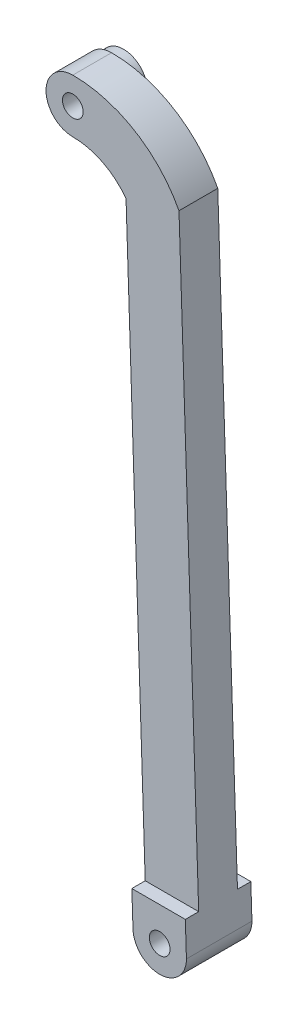
ISO-10303-21;
HEADER;
FILE_DESCRIPTION(('STEP AP214'),'2;1');
FILE_NAME('part.step','',(''),(''),'','','');
FILE_SCHEMA(('AUTOMOTIVE_DESIGN { 1 0 10303 214 1 1 1 1 }'));
ENDSEC;
DATA;
#1=APPLICATION_CONTEXT('core data for automotive mechanical design processes');
#2=APPLICATION_PROTOCOL_DEFINITION('international standard','automotive_design',2000,#1);
#3=PRODUCT_CONTEXT('',#1,'mechanical');
#4=PRODUCT('Part','Part','',(#3));
#5=PRODUCT_RELATED_PRODUCT_CATEGORY('part','',(#4));
#6=PRODUCT_DEFINITION_FORMATION('','',#4);
#7=PRODUCT_DEFINITION_CONTEXT('part definition',#1,'design');
#8=PRODUCT_DEFINITION('design','',#6,#7);
#9=PRODUCT_DEFINITION_SHAPE('','',#8);
#10=(LENGTH_UNIT() NAMED_UNIT(*) SI_UNIT(.MILLI.,.METRE.));
#11=(NAMED_UNIT(*) PLANE_ANGLE_UNIT() SI_UNIT($,.RADIAN.));
#12=(NAMED_UNIT(*) SI_UNIT($,.STERADIAN.) SOLID_ANGLE_UNIT());
#13=UNCERTAINTY_MEASURE_WITH_UNIT(LENGTH_MEASURE(1.E-05),#10,'distance_accuracy_value','');
#14=(GEOMETRIC_REPRESENTATION_CONTEXT(3) GLOBAL_UNCERTAINTY_ASSIGNED_CONTEXT((#13)) GLOBAL_UNIT_ASSIGNED_CONTEXT((#10,
#11,#12)) REPRESENTATION_CONTEXT('',''));
#15=CARTESIAN_POINT('',(0.,0.,0.));
#16=DIRECTION('',(0.,0.,1.));
#17=DIRECTION('',(1.,0.,0.));
#18=AXIS2_PLACEMENT_3D('',#15,#16,#17);
#19=CARTESIAN_POINT('',(-14.9999999999995,86.0802107758638,-2.9));
#20=DIRECTION('',(0.,0.,-1.));
#21=DIRECTION('',(1.,0.,0.));
#22=AXIS2_PLACEMENT_3D('',#19,#20,#21);
#23=PLANE('',#22);
#24=CARTESIAN_POINT('',(-14.9999999999995,86.0802107758638,-2.9));
#25=DIRECTION('',(0.,0.,1.));
#26=DIRECTION('',(1.,0.,0.));
#27=AXIS2_PLACEMENT_3D('',#24,#25,#26);
#28=CIRCLE('',#27,17.9197892241362);
#29=CARTESIAN_POINT('',(0.886406152850304,94.3712267198939,-2.9));
#30=VERTEX_POINT('',#29);
#31=CARTESIAN_POINT('',(-15.,104.,-2.9));
#32=VERTEX_POINT('',#31);
#33=EDGE_CURVE('E113',#30,#32,#28,.T.);
#34=ORIENTED_EDGE('',*,*,#33,.F.);
#35=DIRECTION('',(-0.0329750995146301,0.999456173532387,0.));
#36=VECTOR('',#35,1.);
#37=CARTESIAN_POINT('',(0.886406152850304,94.3712267198939,-2.9));
#38=LINE('',#37,#36);
#39=CARTESIAN_POINT('',(3.83368811201994,5.04081702921773,-2.9));
#40=VERTEX_POINT('',#39);
#41=EDGE_CURVE('E117',#40,#30,#38,.T.);
#42=ORIENTED_EDGE('',*,*,#41,.F.);
#43=DIRECTION('',(1.,0.,0.));
#44=VECTOR('',#43,1.);
#45=CARTESIAN_POINT('',(-4.16631188798006,5.04081702921773,-2.9));
#46=LINE('',#45,#44);
#47=CARTESIAN_POINT('',(-4.16631188798006,5.04081702921773,-2.9));
#48=VERTEX_POINT('',#47);
#49=EDGE_CURVE('E131',#48,#40,#46,.T.);
#50=ORIENTED_EDGE('',*,*,#49,.F.);
#51=DIRECTION('',(0.0329750995146301,-0.999456173532387,0.));
#52=VECTOR('',#51,1.);
#53=CARTESIAN_POINT('',(-7.03513466607657,91.993174369846,-2.9));
#54=LINE('',#53,#52);
#55=CARTESIAN_POINT('',(-7.03513466607657,91.993174369846,-2.9));
#56=VERTEX_POINT('',#55);
#57=EDGE_CURVE('E208',#56,#48,#54,.T.);
#58=ORIENTED_EDGE('',*,*,#57,.F.);
#59=CARTESIAN_POINT('',(-15.,86.0802107758631,-2.9));
#60=DIRECTION('',(0.,0.,-1.));
#61=DIRECTION('',(1.,0.,0.));
#62=AXIS2_PLACEMENT_3D('',#59,#60,#61);
#63=CIRCLE('',#62,9.91978922413689);
#64=CARTESIAN_POINT('',(-15.,96.,-2.9));
#65=VERTEX_POINT('',#64);
#66=EDGE_CURVE('E206',#65,#56,#63,.T.);
#67=ORIENTED_EDGE('',*,*,#66,.F.);
#68=CARTESIAN_POINT('',(-15.,100.,-2.9));
#69=DIRECTION('',(0.,0.,1.));
#70=DIRECTION('',(1.,0.,0.));
#71=AXIS2_PLACEMENT_3D('',#68,#69,#70);
#72=CIRCLE('',#71,4.);
#73=EDGE_CURVE('E119',#32,#65,#72,.T.);
#74=ORIENTED_EDGE('',*,*,#73,.F.);
#75=EDGE_LOOP('',(#34,#42,#50,#58,#67,#74));
#76=FACE_BOUND('',#75,.T.);
#77=CARTESIAN_POINT('',(-15.,100.,-2.9));
#78=DIRECTION('',(0.,0.,-1.));
#79=DIRECTION('',(-1.,0.,0.));
#80=AXIS2_PLACEMENT_3D('',#77,#78,#79);
#81=CIRCLE('',#80,3.55);
#82=CARTESIAN_POINT('',(-18.55,100.,-2.9));
#83=VERTEX_POINT('',#82);
#84=EDGE_CURVE('E212',#83,#83,#81,.T.);
#85=ORIENTED_EDGE('',*,*,#84,.F.);
#86=EDGE_LOOP('',(#85));
#87=FACE_BOUND('',#86,.T.);
#88=ADVANCED_FACE('F35',(#76,#87),#23,.T.);
#89=CARTESIAN_POINT('',(-15.,86.0802107758631,-4.9));
#90=DIRECTION('',(0.,0.,1.));
#91=DIRECTION('',(1.,0.,0.));
#92=AXIS2_PLACEMENT_3D('',#89,#90,#91);
#93=CYLINDRICAL_SURFACE('',#92,9.91978922413684);
#94=ORIENTED_EDGE('',*,*,#66,.T.);
#95=DIRECTION('',(0.,0.,1.));
#96=VECTOR('',#95,1.);
#97=CARTESIAN_POINT('',(-7.03513466607657,91.993174369846,-4.9));
#98=LINE('',#97,#96);
#99=CARTESIAN_POINT('',(-7.03513466607657,91.993174369846,2.9));
#100=VERTEX_POINT('',#99);
#101=EDGE_CURVE('E39',#56,#100,#98,.T.);
#102=ORIENTED_EDGE('',*,*,#101,.T.);
#103=CARTESIAN_POINT('',(-15.,86.0802107758631,2.9));
#104=DIRECTION('',(0.,0.,-1.));
#105=DIRECTION('',(1.,0.,0.));
#106=AXIS2_PLACEMENT_3D('',#103,#104,#105);
#107=CIRCLE('',#106,9.91978922413689);
#108=CARTESIAN_POINT('',(-15.,96.,2.9));
#109=VERTEX_POINT('',#108);
#110=EDGE_CURVE('E194',#109,#100,#107,.T.);
#111=ORIENTED_EDGE('',*,*,#110,.F.);
#112=DIRECTION('',(0.,0.,1.));
#113=VECTOR('',#112,1.);
#114=CARTESIAN_POINT('',(-15.,96.,-4.9));
#115=LINE('',#114,#113);
#116=EDGE_CURVE('E11',#65,#109,#115,.T.);
#117=ORIENTED_EDGE('',*,*,#116,.F.);
#118=EDGE_LOOP('',(#94,#102,#111,#117));
#119=FACE_BOUND('',#118,.T.);
#120=ADVANCED_FACE('F37',(#119),#93,.F.);
#121=CARTESIAN_POINT('',(-15.,100.,-4.9));
#122=DIRECTION('',(0.,0.,1.));
#123=DIRECTION('',(1.,0.,0.));
#124=AXIS2_PLACEMENT_3D('',#121,#122,#123);
#125=CYLINDRICAL_SURFACE('',#124,4.);
#126=DIRECTION('',(0.,0.,1.));
#127=VECTOR('',#126,1.);
#128=CARTESIAN_POINT('',(-15.,104.,-4.9));
#129=LINE('',#128,#127);
#130=CARTESIAN_POINT('',(-15.,104.,2.9));
#131=VERTEX_POINT('',#130);
#132=EDGE_CURVE('E44',#32,#131,#129,.T.);
#133=ORIENTED_EDGE('',*,*,#132,.F.);
#134=ORIENTED_EDGE('',*,*,#73,.T.);
#135=ORIENTED_EDGE('',*,*,#116,.T.);
#136=CARTESIAN_POINT('',(-15.,100.,2.9));
#137=DIRECTION('',(0.,0.,1.));
#138=DIRECTION('',(1.,0.,0.));
#139=AXIS2_PLACEMENT_3D('',#136,#137,#138);
#140=CIRCLE('',#139,4.);
#141=EDGE_CURVE('E196',#131,#109,#140,.T.);
#142=ORIENTED_EDGE('',*,*,#141,.F.);
#143=EDGE_LOOP('',(#133,#134,#135,#142));
#144=FACE_BOUND('',#143,.T.);
#145=ADVANCED_FACE('F244',(#144),#125,.T.);
#146=CARTESIAN_POINT('',(-15.,86.0802107758631,-4.9));
#147=DIRECTION('',(0.,0.,1.));
#148=DIRECTION('',(1.,0.,0.));
#149=AXIS2_PLACEMENT_3D('',#146,#147,#148);
#150=CYLINDRICAL_SURFACE('',#149,17.9197892241369);
#151=ORIENTED_EDGE('',*,*,#33,.T.);
#152=ORIENTED_EDGE('',*,*,#132,.T.);
#153=CARTESIAN_POINT('',(-14.9999999999995,86.0802107758638,2.9));
#154=DIRECTION('',(0.,0.,1.));
#155=DIRECTION('',(1.,0.,0.));
#156=AXIS2_PLACEMENT_3D('',#153,#154,#155);
#157=CIRCLE('',#156,17.9197892241362);
#158=CARTESIAN_POINT('',(0.886406152850304,94.3712267198939,2.9));
#159=VERTEX_POINT('',#158);
#160=EDGE_CURVE('E136',#159,#131,#157,.T.);
#161=ORIENTED_EDGE('',*,*,#160,.F.);
#162=DIRECTION('',(0.,0.,1.));
#163=VECTOR('',#162,1.);
#164=CARTESIAN_POINT('',(0.886406152850304,94.3712267198939,-4.9));
#165=LINE('',#164,#163);
#166=EDGE_CURVE('E129',#30,#159,#165,.T.);
#167=ORIENTED_EDGE('',*,*,#166,.F.);
#168=EDGE_LOOP('',(#151,#152,#161,#167));
#169=FACE_BOUND('',#168,.T.);
#170=ADVANCED_FACE('F134',(#169),#150,.T.);
#171=CARTESIAN_POINT('',(-15.,100.,-4.9));
#172=DIRECTION('',(0.,0.,1.));
#173=DIRECTION('',(1.,0.,0.));
#174=AXIS2_PLACEMENT_3D('',#171,#172,#173);
#175=CYLINDRICAL_SURFACE('',#174,1.55);
#176=CARTESIAN_POINT('',(-15.,100.,2.9));
#177=DIRECTION('',(0.,0.,1.));
#178=DIRECTION('',(1.,0.,0.));
#179=AXIS2_PLACEMENT_3D('',#176,#177,#178);
#180=CIRCLE('',#179,1.55);
#181=CARTESIAN_POINT('',(-13.45,100.,2.9));
#182=VERTEX_POINT('',#181);
#183=EDGE_CURVE('E176',#182,#182,#180,.F.);
#184=ORIENTED_EDGE('',*,*,#183,.F.);
#185=EDGE_LOOP('',(#184));
#186=FACE_BOUND('',#185,.T.);
#187=CARTESIAN_POINT('',(-15.,100.,-4.7));
#188=DIRECTION('',(0.,0.,-1.));
#189=DIRECTION('',(-1.,0.,0.));
#190=AXIS2_PLACEMENT_3D('',#187,#188,#189);
#191=CIRCLE('',#190,1.55);
#192=CARTESIAN_POINT('',(-16.55,100.,-4.7));
#193=VERTEX_POINT('',#192);
#194=EDGE_CURVE('E215',#193,#193,#191,.T.);
#195=ORIENTED_EDGE('',*,*,#194,.T.);
#196=EDGE_LOOP('',(#195));
#197=FACE_BOUND('',#196,.T.);
#198=ADVANCED_FACE('F221',(#186,#197),#175,.F.);
#199=CARTESIAN_POINT('',(3.995650571248,0.131828667130967,-4.9));
#200=DIRECTION('',(0.999456173532387,0.0329750995146301,0.));
#201=DIRECTION('',(-0.0329750995146301,0.999456173532387,0.));
#202=AXIS2_PLACEMENT_3D('',#199,#200,#201);
#203=PLANE('',#202);
#204=DIRECTION('',(-0.0329750995146301,0.999456173532387,0.));
#205=VECTOR('',#204,1.);
#206=CARTESIAN_POINT('',(3.995650571248,0.131828667130967,-4.9));
#207=LINE('',#206,#205);
#208=CARTESIAN_POINT('',(4.,0.,-4.9));
#209=VERTEX_POINT('',#208);
#210=CARTESIAN_POINT('',(3.83368811201994,5.04081702921773,-4.9));
#211=VERTEX_POINT('',#210);
#212=EDGE_CURVE('E153',#209,#211,#207,.T.);
#213=ORIENTED_EDGE('',*,*,#212,.T.);
#214=DIRECTION('',(0.,0.,-1.));
#215=VECTOR('',#214,1.);
#216=CARTESIAN_POINT('',(3.83368811201994,5.04081702921773,-2.9));
#217=LINE('',#216,#215);
#218=EDGE_CURVE('E52',#40,#211,#217,.T.);
#219=ORIENTED_EDGE('',*,*,#218,.F.);
#220=ORIENTED_EDGE('',*,*,#41,.T.);
#221=ORIENTED_EDGE('',*,*,#166,.T.);
#222=DIRECTION('',(-0.0329750995146301,0.999456173532387,0.));
#223=VECTOR('',#222,1.);
#224=CARTESIAN_POINT('',(0.886406152850304,94.3712267198939,2.9));
#225=LINE('',#224,#223);
#226=CARTESIAN_POINT('',(3.83368811201994,5.04081702921773,2.9));
#227=VERTEX_POINT('',#226);
#228=EDGE_CURVE('E181',#227,#159,#225,.T.);
#229=ORIENTED_EDGE('',*,*,#228,.F.);
#230=DIRECTION('',(0.,0.,1.));
#231=VECTOR('',#230,1.);
#232=CARTESIAN_POINT('',(3.83368811201994,5.04081702921773,2.9));
#233=LINE('',#232,#231);
#234=CARTESIAN_POINT('',(3.83368811201994,5.04081702921773,4.9));
#235=VERTEX_POINT('',#234);
#236=EDGE_CURVE('E179',#227,#235,#233,.T.);
#237=ORIENTED_EDGE('',*,*,#236,.T.);
#238=DIRECTION('',(-0.0329750995146301,0.999456173532387,0.));
#239=VECTOR('',#238,1.);
#240=CARTESIAN_POINT('',(3.995650571248,0.131828667130967,4.9));
#241=LINE('',#240,#239);
#242=CARTESIAN_POINT('',(4.,0.,4.9));
#243=VERTEX_POINT('',#242);
#244=EDGE_CURVE('E168',#243,#235,#241,.T.);
#245=ORIENTED_EDGE('',*,*,#244,.F.);
#246=DIRECTION('',(0.,0.,1.));
#247=VECTOR('',#246,1.);
#248=CARTESIAN_POINT('',(4.,0.,-4.9));
#249=LINE('',#248,#247);
#250=EDGE_CURVE('E137',#209,#243,#249,.T.);
#251=ORIENTED_EDGE('',*,*,#250,.F.);
#252=EDGE_LOOP('',(#213,#219,#220,#221,#229,#237,#245,#251));
#253=FACE_BOUND('',#252,.T.);
#254=ADVANCED_FACE('F127',(#253),#203,.T.);
#255=CARTESIAN_POINT('',(-3.995650571248,-0.131828667130967,-4.9));
#256=DIRECTION('',(0.999456173532387,0.0329750995146301,0.));
#257=DIRECTION('',(-0.0329750995146301,0.999456173532387,0.));
#258=AXIS2_PLACEMENT_3D('',#255,#256,#257);
#259=PLANE('',#258);
#260=DIRECTION('',(0.,0.,-1.));
#261=VECTOR('',#260,1.);
#262=CARTESIAN_POINT('',(-4.16631188798006,5.04081702921773,-2.9));
#263=LINE('',#262,#261);
#264=CARTESIAN_POINT('',(-4.16631188798006,5.04081702921773,-4.9));
#265=VERTEX_POINT('',#264);
#266=EDGE_CURVE('E186',#48,#265,#263,.T.);
#267=ORIENTED_EDGE('',*,*,#266,.T.);
#268=DIRECTION('',(-0.0329750995146301,0.999456173532387,0.));
#269=VECTOR('',#268,1.);
#270=CARTESIAN_POINT('',(-3.995650571248,-0.131828667130967,-4.9));
#271=LINE('',#270,#269);
#272=CARTESIAN_POINT('',(-4.,0.,-4.9));
#273=VERTEX_POINT('',#272);
#274=EDGE_CURVE('E162',#273,#265,#271,.T.);
#275=ORIENTED_EDGE('',*,*,#274,.F.);
#276=DIRECTION('',(0.,0.,1.));
#277=VECTOR('',#276,1.);
#278=CARTESIAN_POINT('',(-4.,0.,-4.9));
#279=LINE('',#278,#277);
#280=CARTESIAN_POINT('',(-4.,0.,4.9));
#281=VERTEX_POINT('',#280);
#282=EDGE_CURVE('E140',#273,#281,#279,.T.);
#283=ORIENTED_EDGE('',*,*,#282,.T.);
#284=DIRECTION('',(-0.0329750995146301,0.999456173532387,0.));
#285=VECTOR('',#284,1.);
#286=CARTESIAN_POINT('',(-3.995650571248,-0.131828667130967,4.9));
#287=LINE('',#286,#285);
#288=CARTESIAN_POINT('',(-4.16631188798006,5.04081702921773,4.9));
#289=VERTEX_POINT('',#288);
#290=EDGE_CURVE('E174',#281,#289,#287,.T.);
#291=ORIENTED_EDGE('',*,*,#290,.T.);
#292=DIRECTION('',(0.,0.,1.));
#293=VECTOR('',#292,1.);
#294=CARTESIAN_POINT('',(-4.16631188798006,5.04081702921773,2.9));
#295=LINE('',#294,#293);
#296=CARTESIAN_POINT('',(-4.16631188798006,5.04081702921773,2.9));
#297=VERTEX_POINT('',#296);
#298=EDGE_CURVE('E60',#297,#289,#295,.T.);
#299=ORIENTED_EDGE('',*,*,#298,.F.);
#300=DIRECTION('',(0.0329750995146301,-0.999456173532387,0.));
#301=VECTOR('',#300,1.);
#302=CARTESIAN_POINT('',(-7.03513466607657,91.993174369846,2.9));
#303=LINE('',#302,#301);
#304=EDGE_CURVE('E191',#100,#297,#303,.T.);
#305=ORIENTED_EDGE('',*,*,#304,.F.);
#306=ORIENTED_EDGE('',*,*,#101,.F.);
#307=ORIENTED_EDGE('',*,*,#57,.T.);
#308=EDGE_LOOP('',(#267,#275,#283,#291,#299,#305,#306,#307));
#309=FACE_BOUND('',#308,.T.);
#310=ADVANCED_FACE('F261',(#309),#259,.F.);
#311=CARTESIAN_POINT('',(0.,0.,-4.9));
#312=DIRECTION('',(0.,0.,1.));
#313=DIRECTION('',(1.,0.,0.));
#314=AXIS2_PLACEMENT_3D('',#311,#312,#313);
#315=PLANE('',#314);
#316=CARTESIAN_POINT('',(0.,0.,-4.9));
#317=DIRECTION('',(0.,0.,1.));
#318=DIRECTION('',(1.,0.,0.));
#319=AXIS2_PLACEMENT_3D('',#316,#317,#318);
#320=CIRCLE('',#319,1.55);
#321=CARTESIAN_POINT('',(1.55,0.,-4.9));
#322=VERTEX_POINT('',#321);
#323=EDGE_CURVE('E146',#322,#322,#320,.T.);
#324=ORIENTED_EDGE('',*,*,#323,.T.);
#325=EDGE_LOOP('',(#324));
#326=FACE_BOUND('',#325,.T.);
#327=DIRECTION('',(1.,0.,0.));
#328=VECTOR('',#327,1.);
#329=CARTESIAN_POINT('',(-4.16631188798006,5.04081702921773,-4.9));
#330=LINE('',#329,#328);
#331=EDGE_CURVE('E123',#265,#211,#330,.T.);
#332=ORIENTED_EDGE('',*,*,#331,.T.);
#333=ORIENTED_EDGE('',*,*,#212,.F.);
#334=CARTESIAN_POINT('',(0.,0.,-4.9));
#335=DIRECTION('',(0.,0.,1.));
#336=DIRECTION('',(1.,0.,0.));
#337=AXIS2_PLACEMENT_3D('',#334,#335,#336);
#338=CIRCLE('',#337,4.);
#339=EDGE_CURVE('E157',#273,#209,#338,.T.);
#340=ORIENTED_EDGE('',*,*,#339,.F.);
#341=ORIENTED_EDGE('',*,*,#274,.T.);
#342=EDGE_LOOP('',(#332,#333,#340,#341));
#343=FACE_BOUND('',#342,.T.);
#344=ADVANCED_FACE('F257',(#326,#343),#315,.F.);
#345=CARTESIAN_POINT('',(0.,0.,-4.9));
#346=DIRECTION('',(0.,0.,1.));
#347=DIRECTION('',(1.,0.,0.));
#348=AXIS2_PLACEMENT_3D('',#345,#346,#347);
#349=CYLINDRICAL_SURFACE('',#348,4.);
#350=ORIENTED_EDGE('',*,*,#250,.T.);
#351=CARTESIAN_POINT('',(0.,0.,4.9));
#352=DIRECTION('',(0.,0.,1.));
#353=DIRECTION('',(1.,0.,0.));
#354=AXIS2_PLACEMENT_3D('',#351,#352,#353);
#355=CIRCLE('',#354,4.);
#356=EDGE_CURVE('E171',#281,#243,#355,.T.);
#357=ORIENTED_EDGE('',*,*,#356,.F.);
#358=ORIENTED_EDGE('',*,*,#282,.F.);
#359=ORIENTED_EDGE('',*,*,#339,.T.);
#360=EDGE_LOOP('',(#350,#357,#358,#359));
#361=FACE_BOUND('',#360,.T.);
#362=ADVANCED_FACE('F260',(#361),#349,.T.);
#363=CARTESIAN_POINT('',(0.,0.,-4.9));
#364=DIRECTION('',(0.,0.,1.));
#365=DIRECTION('',(1.,0.,0.));
#366=AXIS2_PLACEMENT_3D('',#363,#364,#365);
#367=CYLINDRICAL_SURFACE('',#366,1.55);
#368=ORIENTED_EDGE('',*,*,#323,.F.);
#369=EDGE_LOOP('',(#368));
#370=FACE_BOUND('',#369,.T.);
#371=CARTESIAN_POINT('',(0.,0.,4.9));
#372=DIRECTION('',(0.,0.,1.));
#373=DIRECTION('',(1.,0.,0.));
#374=AXIS2_PLACEMENT_3D('',#371,#372,#373);
#375=CIRCLE('',#374,1.55);
#376=CARTESIAN_POINT('',(1.55,0.,4.9));
#377=VERTEX_POINT('',#376);
#378=EDGE_CURVE('E165',#377,#377,#375,.T.);
#379=ORIENTED_EDGE('',*,*,#378,.T.);
#380=EDGE_LOOP('',(#379));
#381=FACE_BOUND('',#380,.T.);
#382=ADVANCED_FACE('F255',(#370,#381),#367,.F.);
#383=CARTESIAN_POINT('',(0.,0.,4.9));
#384=DIRECTION('',(0.,0.,1.));
#385=DIRECTION('',(1.,0.,0.));
#386=AXIS2_PLACEMENT_3D('',#383,#384,#385);
#387=PLANE('',#386);
#388=DIRECTION('',(1.,0.,0.));
#389=VECTOR('',#388,1.);
#390=CARTESIAN_POINT('',(-4.16631188798006,5.04081702921773,4.9));
#391=LINE('',#390,#389);
#392=EDGE_CURVE('E184',#289,#235,#391,.T.);
#393=ORIENTED_EDGE('',*,*,#392,.F.);
#394=ORIENTED_EDGE('',*,*,#290,.F.);
#395=ORIENTED_EDGE('',*,*,#356,.T.);
#396=ORIENTED_EDGE('',*,*,#244,.T.);
#397=EDGE_LOOP('',(#393,#394,#395,#396));
#398=FACE_BOUND('',#397,.T.);
#399=ORIENTED_EDGE('',*,*,#378,.F.);
#400=EDGE_LOOP('',(#399));
#401=FACE_BOUND('',#400,.T.);
#402=ADVANCED_FACE('F249',(#398,#401),#387,.T.);
#403=CARTESIAN_POINT('',(-14.9999999999995,86.0802107758638,2.9));
#404=DIRECTION('',(0.,0.,1.));
#405=DIRECTION('',(1.,0.,0.));
#406=AXIS2_PLACEMENT_3D('',#403,#404,#405);
#407=PLANE('',#406);
#408=ORIENTED_EDGE('',*,*,#160,.T.);
#409=ORIENTED_EDGE('',*,*,#141,.T.);
#410=ORIENTED_EDGE('',*,*,#110,.T.);
#411=ORIENTED_EDGE('',*,*,#304,.T.);
#412=DIRECTION('',(1.,0.,0.));
#413=VECTOR('',#412,1.);
#414=CARTESIAN_POINT('',(-4.16631188798006,5.04081702921773,2.9));
#415=LINE('',#414,#413);
#416=EDGE_CURVE('E188',#297,#227,#415,.T.);
#417=ORIENTED_EDGE('',*,*,#416,.T.);
#418=ORIENTED_EDGE('',*,*,#228,.T.);
#419=EDGE_LOOP('',(#408,#409,#410,#411,#417,#418));
#420=FACE_BOUND('',#419,.T.);
#421=ORIENTED_EDGE('',*,*,#183,.T.);
#422=EDGE_LOOP('',(#421));
#423=FACE_BOUND('',#422,.T.);
#424=ADVANCED_FACE('F246',(#420,#423),#407,.T.);
#425=CARTESIAN_POINT('',(-4.16631188798006,5.04081702921773,2.9));
#426=DIRECTION('',(0.,-1.,0.));
#427=DIRECTION('',(0.,0.,-1.));
#428=AXIS2_PLACEMENT_3D('',#425,#426,#427);
#429=PLANE('',#428);
#430=ORIENTED_EDGE('',*,*,#392,.T.);
#431=ORIENTED_EDGE('',*,*,#236,.F.);
#432=ORIENTED_EDGE('',*,*,#416,.F.);
#433=ORIENTED_EDGE('',*,*,#298,.T.);
#434=EDGE_LOOP('',(#430,#431,#432,#433));
#435=FACE_BOUND('',#434,.T.);
#436=ADVANCED_FACE('F235',(#435),#429,.F.);
#437=CARTESIAN_POINT('',(-4.16631188798006,5.04081702921773,-2.9));
#438=DIRECTION('',(0.,1.,0.));
#439=DIRECTION('',(0.,0.,1.));
#440=AXIS2_PLACEMENT_3D('',#437,#438,#439);
#441=PLANE('',#440);
#442=ORIENTED_EDGE('',*,*,#331,.F.);
#443=ORIENTED_EDGE('',*,*,#266,.F.);
#444=ORIENTED_EDGE('',*,*,#49,.T.);
#445=ORIENTED_EDGE('',*,*,#218,.T.);
#446=EDGE_LOOP('',(#442,#443,#444,#445));
#447=FACE_BOUND('',#446,.T.);
#448=ADVANCED_FACE('F226',(#447),#441,.T.);
#449=CARTESIAN_POINT('',(-15.,100.,-4.7));
#450=DIRECTION('',(0.,0.,-1.));
#451=DIRECTION('',(-1.,0.,0.));
#452=AXIS2_PLACEMENT_3D('',#449,#450,#451);
#453=PLANE('',#452);
#454=CARTESIAN_POINT('',(-15.,100.,-4.7));
#455=DIRECTION('',(0.,0.,-1.));
#456=DIRECTION('',(-1.,0.,0.));
#457=AXIS2_PLACEMENT_3D('',#454,#455,#456);
#458=CIRCLE('',#457,3.55);
#459=CARTESIAN_POINT('',(-18.55,100.,-4.7));
#460=VERTEX_POINT('',#459);
#461=EDGE_CURVE('E204',#460,#460,#458,.T.);
#462=ORIENTED_EDGE('',*,*,#461,.T.);
#463=EDGE_LOOP('',(#462));
#464=FACE_BOUND('',#463,.T.);
#465=ORIENTED_EDGE('',*,*,#194,.F.);
#466=EDGE_LOOP('',(#465));
#467=FACE_BOUND('',#466,.T.);
#468=ADVANCED_FACE('F223',(#464,#467),#453,.T.);
#469=CARTESIAN_POINT('',(-15.,100.,-4.7));
#470=DIRECTION('',(0.,0.,1.));
#471=DIRECTION('',(1.,0.,0.));
#472=AXIS2_PLACEMENT_3D('',#469,#470,#471);
#473=CYLINDRICAL_SURFACE('',#472,3.55);
#474=ORIENTED_EDGE('',*,*,#461,.F.);
#475=EDGE_LOOP('',(#474));
#476=FACE_BOUND('',#475,.T.);
#477=ORIENTED_EDGE('',*,*,#84,.T.);
#478=EDGE_LOOP('',(#477));
#479=FACE_BOUND('',#478,.T.);
#480=ADVANCED_FACE('F225',(#476,#479),#473,.T.);
#481=CLOSED_SHELL('',(#88,#120,#145,#170,#198,#254,#310,#344,#362,#382,#402,#424,#436,#448,#468,#480));
#482=MANIFOLD_SOLID_BREP('B2',#481);
#483=ADVANCED_BREP_SHAPE_REPRESENTATION('',(#18,#482),#14);
#484=SHAPE_DEFINITION_REPRESENTATION(#9,#483);
ENDSEC;
END-ISO-10303-21;
